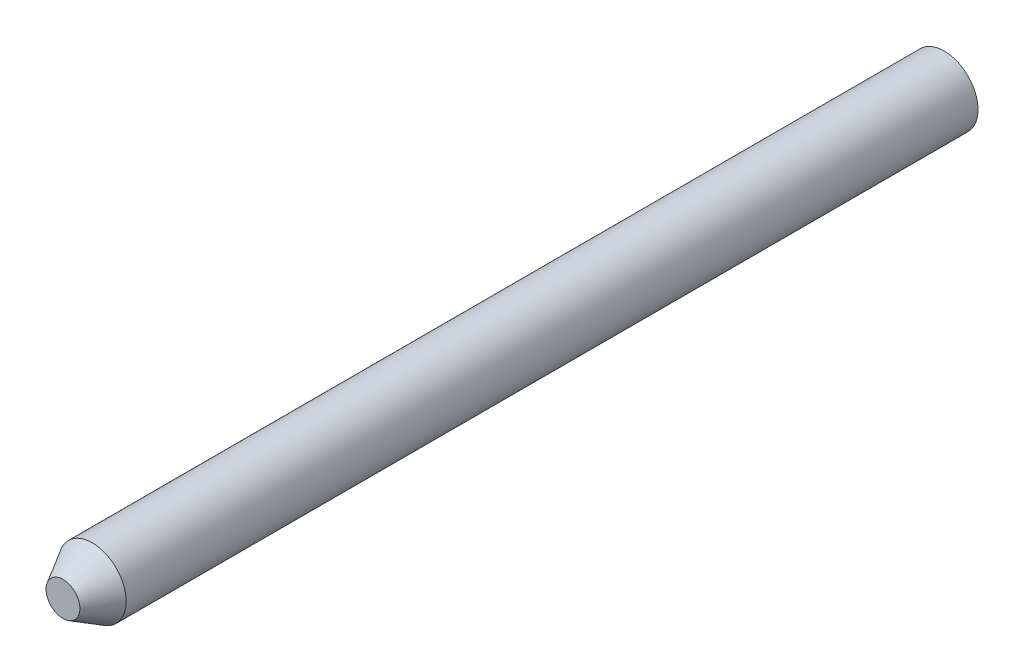
ISO-10303-21;
HEADER;
FILE_DESCRIPTION(('STEP AP214'),'2;1');
FILE_NAME('part.step','',(''),(''),'','','');
FILE_SCHEMA(('AUTOMOTIVE_DESIGN { 1 0 10303 214 1 1 1 1 }'));
ENDSEC;
DATA;
#1=APPLICATION_CONTEXT('core data for automotive mechanical design processes');
#2=APPLICATION_PROTOCOL_DEFINITION('international standard','automotive_design',2000,#1);
#3=PRODUCT_CONTEXT('',#1,'mechanical');
#4=PRODUCT('Part','Part','',(#3));
#5=PRODUCT_RELATED_PRODUCT_CATEGORY('part','',(#4));
#6=PRODUCT_DEFINITION_FORMATION('','',#4);
#7=PRODUCT_DEFINITION_CONTEXT('part definition',#1,'design');
#8=PRODUCT_DEFINITION('design','',#6,#7);
#9=PRODUCT_DEFINITION_SHAPE('','',#8);
#10=(LENGTH_UNIT() NAMED_UNIT(*) SI_UNIT(.MILLI.,.METRE.));
#11=(NAMED_UNIT(*) PLANE_ANGLE_UNIT() SI_UNIT($,.RADIAN.));
#12=(NAMED_UNIT(*) SI_UNIT($,.STERADIAN.) SOLID_ANGLE_UNIT());
#13=UNCERTAINTY_MEASURE_WITH_UNIT(LENGTH_MEASURE(1.E-05),#10,'distance_accuracy_value','');
#14=(GEOMETRIC_REPRESENTATION_CONTEXT(3) GLOBAL_UNCERTAINTY_ASSIGNED_CONTEXT((#13)) GLOBAL_UNIT_ASSIGNED_CONTEXT((#10,
#11,#12)) REPRESENTATION_CONTEXT('',''));
#15=CARTESIAN_POINT('',(0.,0.,0.));
#16=DIRECTION('',(0.,0.,1.));
#17=DIRECTION('',(1.,0.,0.));
#18=AXIS2_PLACEMENT_3D('',#15,#16,#17);
#19=CARTESIAN_POINT('',(0.,0.,52.));
#20=DIRECTION('',(0.,0.,-1.));
#21=DIRECTION('',(-1.,0.,0.));
#22=AXIS2_PLACEMENT_3D('',#19,#20,#21);
#23=CYLINDRICAL_SURFACE('',#22,2.);
#24=CARTESIAN_POINT('',(0.,0.,50.2679491924311));
#25=DIRECTION('',(0.,0.,1.));
#26=DIRECTION('',(1.,0.,0.));
#27=AXIS2_PLACEMENT_3D('',#24,#25,#26);
#28=CIRCLE('',#27,2.);
#29=CARTESIAN_POINT('',(-2.,0.,50.2679491924311));
#30=VERTEX_POINT('',#29);
#31=EDGE_CURVE('E10',#30,#30,#28,.F.);
#32=CARTESIAN_POINT('',(0.,0.,0.));
#33=DIRECTION('',(0.,0.,1.));
#34=DIRECTION('',(1.,0.,0.));
#35=AXIS2_PLACEMENT_3D('',#32,#33,#34);
#36=CIRCLE('',#35,2.);
#37=CARTESIAN_POINT('',(-2.,0.,0.));
#38=VERTEX_POINT('',#37);
#39=EDGE_CURVE('E55',#38,#38,#36,.T.);
#40=CARTESIAN_POINT('',(-2.,0.,50.2679491924311));
#41=CARTESIAN_POINT('',(-2.,0.,49.7443247216766));
#42=CARTESIAN_POINT('',(-2.,0.,49.2207002509221));
#43=CARTESIAN_POINT('',(-2.,0.,48.1734513094131));
#44=CARTESIAN_POINT('',(-2.,0.,47.6498268386586));
#45=CARTESIAN_POINT('',(-2.,0.,46.6025778971497));
#46=CARTESIAN_POINT('',(-2.,0.,46.0789534263952));
#47=CARTESIAN_POINT('',(-2.,0.,45.0317044848862));
#48=CARTESIAN_POINT('',(-2.,0.,44.5080800141317));
#49=CARTESIAN_POINT('',(-2.,0.,43.4608310726227));
#50=CARTESIAN_POINT('',(-2.,0.,42.9372066018682));
#51=CARTESIAN_POINT('',(-2.,0.,41.8899576603593));
#52=CARTESIAN_POINT('',(-2.,0.,41.3663331896048));
#53=CARTESIAN_POINT('',(-2.,0.,40.3190842480958));
#54=CARTESIAN_POINT('',(-2.,0.,39.7954597773413));
#55=CARTESIAN_POINT('',(-2.,0.,38.7482108358323));
#56=CARTESIAN_POINT('',(-2.,0.,38.2245863650778));
#57=CARTESIAN_POINT('',(-2.,0.,37.1773374235688));
#58=CARTESIAN_POINT('',(-2.,0.,36.6537129528143));
#59=CARTESIAN_POINT('',(-2.,0.,35.6064640113054));
#60=CARTESIAN_POINT('',(-2.,0.,35.0828395405509));
#61=CARTESIAN_POINT('',(-2.,0.,34.0355905990419));
#62=CARTESIAN_POINT('',(-2.,0.,33.5119661282874));
#63=CARTESIAN_POINT('',(-2.,0.,32.4647171867784));
#64=CARTESIAN_POINT('',(-2.,0.,31.9410927160239));
#65=CARTESIAN_POINT('',(-2.,0.,30.8938437745149));
#66=CARTESIAN_POINT('',(-2.,0.,30.3702193037605));
#67=CARTESIAN_POINT('',(-2.,0.,29.3229703622515));
#68=CARTESIAN_POINT('',(-2.,0.,28.799345891497));
#69=CARTESIAN_POINT('',(-2.,0.,27.752096949988));
#70=CARTESIAN_POINT('',(-2.,0.,27.2284724792335));
#71=CARTESIAN_POINT('',(-2.,0.,26.1812235377245));
#72=CARTESIAN_POINT('',(-2.,0.,25.65759906697));
#73=CARTESIAN_POINT('',(-2.,0.,24.6103501254611));
#74=CARTESIAN_POINT('',(-2.,0.,24.0867256547066));
#75=CARTESIAN_POINT('',(-2.,0.,23.0394767131976));
#76=CARTESIAN_POINT('',(-2.,0.,22.5158522424431));
#77=CARTESIAN_POINT('',(-2.,0.,21.4686033009341));
#78=CARTESIAN_POINT('',(-2.,0.,20.9449788301796));
#79=CARTESIAN_POINT('',(-2.,0.,19.8977298886706));
#80=CARTESIAN_POINT('',(-2.,0.,19.3741054179162));
#81=CARTESIAN_POINT('',(-2.,0.,18.3268564764072));
#82=CARTESIAN_POINT('',(-2.,0.,17.8032320056527));
#83=CARTESIAN_POINT('',(-2.,0.,16.7559830641437));
#84=CARTESIAN_POINT('',(-2.,0.,16.2323585933892));
#85=CARTESIAN_POINT('',(-2.,0.,15.1851096518802));
#86=CARTESIAN_POINT('',(-2.,0.,14.6614851811257));
#87=CARTESIAN_POINT('',(-2.,0.,13.6142362396168));
#88=CARTESIAN_POINT('',(-2.,0.,13.0906117688623));
#89=CARTESIAN_POINT('',(-2.,0.,12.0433628273533));
#90=CARTESIAN_POINT('',(-2.,0.,11.5197383565988));
#91=CARTESIAN_POINT('',(-2.,0.,10.4724894150898));
#92=CARTESIAN_POINT('',(-2.,0.,9.94886494433532));
#93=CARTESIAN_POINT('',(-2.,0.,8.90161600282634));
#94=CARTESIAN_POINT('',(-2.,0.,8.37799153207185));
#95=CARTESIAN_POINT('',(-2.,0.,7.33074259056287));
#96=CARTESIAN_POINT('',(-2.,0.,6.80711811980838));
#97=CARTESIAN_POINT('',(-2.,0.,5.7598691782994));
#98=CARTESIAN_POINT('',(-2.,0.,5.23624470754491));
#99=CARTESIAN_POINT('',(-2.,0.,4.18899576603593));
#100=CARTESIAN_POINT('',(-2.,0.,3.66537129528144));
#101=CARTESIAN_POINT('',(-2.,0.,2.61812235377246));
#102=CARTESIAN_POINT('',(-2.,0.,2.09449788301797));
#103=CARTESIAN_POINT('',(-2.,0.,1.04724894150898));
#104=CARTESIAN_POINT('',(-2.,0.,0.523624470754491));
#105=CARTESIAN_POINT('',(-2.,0.,0.));
#106=B_SPLINE_CURVE_WITH_KNOTS('',3,(#40,#41,#42,#43,#44,#45,#46,#47,#48,#49,#50,#51,#52,#53,
#54,#55,#56,#57,#58,#59,#60,#61,#62,#63,#64,#65,#66,#67,#68,#69,#70,#71,#72,#73,#74,#75,#76,#77,
#78,#79,#80,#81,#82,#83,#84,#85,#86,#87,#88,#89,#90,#91,#92,#93,#94,#95,#96,#97,#98,#99,#100,
#101,#102,#103,#104,#105),.UNSPECIFIED.,.F.,.F.,(4,2,2,2,2,2,2,2,2,2,2,2,2,2,2,2,2,2,2,2,2,2,2,
2,2,2,2,2,2,2,2,2,4),(0.,1.57087341226347,3.14174682452694,4.71262023679041,6.28349364905388,
7.85436706131735,9.42524047358083,10.9961138858443,12.5669872981078,14.1378607103712,
15.7087341226347,17.2796075348982,18.8504809471617,20.4213543594251,21.9922277716886,
23.5631011839521,25.1339745962155,26.704848008479,28.2757214207425,29.846594833006,
31.4174682452694,32.9883416575329,34.5592150697964,36.1300884820598,37.7009618943233,
39.2718353065868,40.8427087188503,42.4135821311137,43.9844555433772,45.5553289556407,
47.1262023679041,48.6970757801676,50.2679491924311),.UNSPECIFIED.);
#107=EDGE_CURVE('BSEAM41',#30,#38,#106,.T.);
#108=ORIENTED_EDGE('',*,*,#31,.T.);
#109=ORIENTED_EDGE('',*,*,#39,.T.);
#110=ORIENTED_EDGE('',*,*,#107,.T.);
#111=ORIENTED_EDGE('',*,*,#107,.F.);
#112=EDGE_LOOP('',(#108,#110,#109,#111));
#113=FACE_BOUND('',#112,.T.);
#114=ADVANCED_FACE('F41',(#113),#23,.T.);
#115=CARTESIAN_POINT('',(0.,0.,52.));
#116=DIRECTION('',(0.,0.,1.));
#117=DIRECTION('',(1.,0.,0.));
#118=AXIS2_PLACEMENT_3D('',#115,#116,#117);
#119=PLANE('',#118);
#120=CARTESIAN_POINT('',(0.,0.,52.));
#121=DIRECTION('',(0.,0.,1.));
#122=DIRECTION('',(1.,0.,0.));
#123=AXIS2_PLACEMENT_3D('',#120,#121,#122);
#124=CIRCLE('',#123,0.999999999999976);
#125=CARTESIAN_POINT('',(0.999999999999976,0.,52.));
#126=VERTEX_POINT('',#125);
#127=EDGE_CURVE('E50',#126,#126,#124,.T.);
#128=ORIENTED_EDGE('',*,*,#127,.T.);
#129=EDGE_LOOP('',(#128));
#130=FACE_BOUND('',#129,.T.);
#131=ADVANCED_FACE('F66',(#130),#119,.T.);
#132=CARTESIAN_POINT('',(0.,0.,0.));
#133=DIRECTION('',(0.,0.,1.));
#134=DIRECTION('',(1.,0.,0.));
#135=AXIS2_PLACEMENT_3D('',#132,#133,#134);
#136=PLANE('',#135);
#137=ORIENTED_EDGE('',*,*,#39,.F.);
#138=EDGE_LOOP('',(#137));
#139=FACE_BOUND('',#138,.T.);
#140=ADVANCED_FACE('F64',(#139),#136,.F.);
#141=CARTESIAN_POINT('',(0.,0.,52.));
#142=DIRECTION('',(0.,0.,-1.));
#143=DIRECTION('',(-1.,0.,0.));
#144=AXIS2_PLACEMENT_3D('',#141,#142,#143);
#145=CONICAL_SURFACE('',#144,0.999999999999976,0.523598775598305);
#146=ORIENTED_EDGE('',*,*,#31,.F.);
#147=EDGE_LOOP('',(#146));
#148=FACE_BOUND('',#147,.T.);
#149=ORIENTED_EDGE('',*,*,#127,.F.);
#150=EDGE_LOOP('',(#149));
#151=FACE_BOUND('',#150,.T.);
#152=ADVANCED_FACE('F44',(#148,#151),#145,.T.);
#153=CLOSED_SHELL('',(#114,#131,#140,#152));
#154=MANIFOLD_SOLID_BREP('B2',#153);
#155=ADVANCED_BREP_SHAPE_REPRESENTATION('',(#18,#154),#14);
#156=SHAPE_DEFINITION_REPRESENTATION(#9,#155);
ENDSEC;
END-ISO-10303-21;
